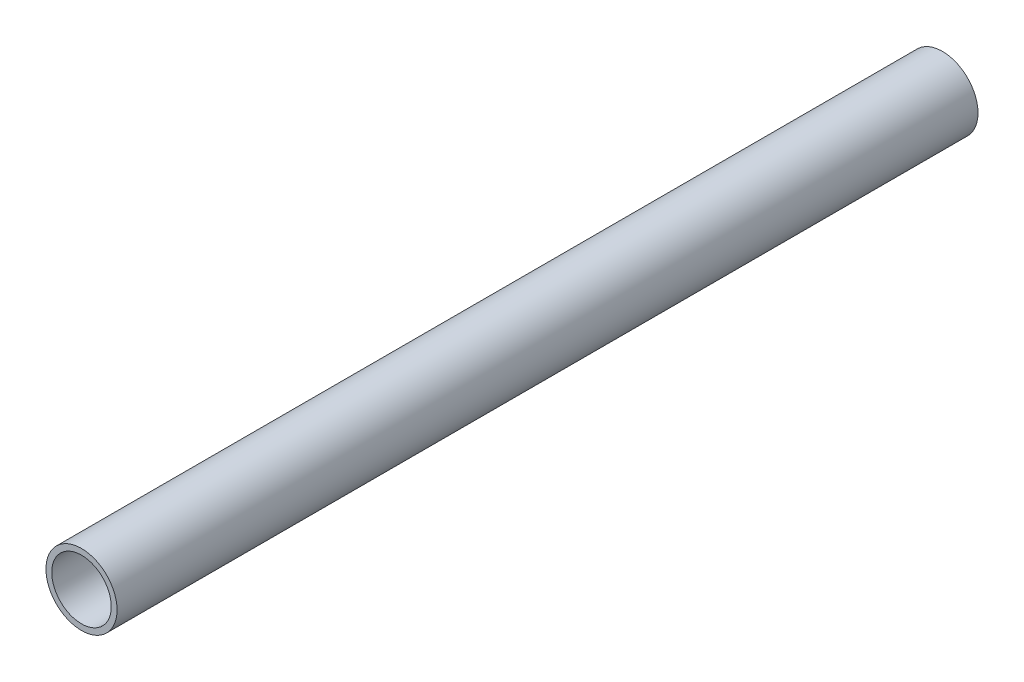
ISO-10303-21;
HEADER;
FILE_DESCRIPTION(('STEP AP214'),'2;1');
FILE_NAME('part.step','',(''),(''),'','','');
FILE_SCHEMA(('AUTOMOTIVE_DESIGN { 1 0 10303 214 1 1 1 1 }'));
ENDSEC;
DATA;
#1=APPLICATION_CONTEXT('core data for automotive mechanical design processes');
#2=APPLICATION_PROTOCOL_DEFINITION('international standard','automotive_design',2000,#1);
#3=PRODUCT_CONTEXT('',#1,'mechanical');
#4=PRODUCT('Part','Part','',(#3));
#5=PRODUCT_RELATED_PRODUCT_CATEGORY('part','',(#4));
#6=PRODUCT_DEFINITION_FORMATION('','',#4);
#7=PRODUCT_DEFINITION_CONTEXT('part definition',#1,'design');
#8=PRODUCT_DEFINITION('design','',#6,#7);
#9=PRODUCT_DEFINITION_SHAPE('','',#8);
#10=(LENGTH_UNIT() NAMED_UNIT(*) SI_UNIT(.MILLI.,.METRE.));
#11=(NAMED_UNIT(*) PLANE_ANGLE_UNIT() SI_UNIT($,.RADIAN.));
#12=(NAMED_UNIT(*) SI_UNIT($,.STERADIAN.) SOLID_ANGLE_UNIT());
#13=UNCERTAINTY_MEASURE_WITH_UNIT(LENGTH_MEASURE(1.E-05),#10,'distance_accuracy_value','');
#14=(GEOMETRIC_REPRESENTATION_CONTEXT(3) GLOBAL_UNCERTAINTY_ASSIGNED_CONTEXT((#13)) GLOBAL_UNIT_ASSIGNED_CONTEXT((#10,
#11,#12)) REPRESENTATION_CONTEXT('',''));
#15=CARTESIAN_POINT('',(0.,0.,0.));
#16=DIRECTION('',(0.,0.,1.));
#17=DIRECTION('',(1.,0.,0.));
#18=AXIS2_PLACEMENT_3D('',#15,#16,#17);
#19=CARTESIAN_POINT('',(0.,0.,584.2));
#20=DIRECTION('',(0.,0.,1.));
#21=DIRECTION('',(1.,0.,0.));
#22=AXIS2_PLACEMENT_3D('',#19,#20,#21);
#23=PLANE('',#22);
#24=CARTESIAN_POINT('',(0.,0.,584.2));
#25=DIRECTION('',(0.,0.,1.));
#26=DIRECTION('',(1.,0.,0.));
#27=AXIS2_PLACEMENT_3D('',#24,#25,#26);
#28=CIRCLE('',#27,24.13);
#29=CARTESIAN_POINT('',(24.13,0.,584.2));
#30=VERTEX_POINT('',#29);
#31=EDGE_CURVE('E10',#30,#30,#28,.T.);
#32=ORIENTED_EDGE('',*,*,#31,.T.);
#33=EDGE_LOOP('',(#32));
#34=FACE_BOUND('',#33,.T.);
#35=CARTESIAN_POINT('',(0.,0.,584.2));
#36=DIRECTION('',(0.,0.,1.));
#37=DIRECTION('',(1.,0.,0.));
#38=AXIS2_PLACEMENT_3D('',#35,#36,#37);
#39=CIRCLE('',#38,20.193);
#40=CARTESIAN_POINT('',(20.193,0.,584.2));
#41=VERTEX_POINT('',#40);
#42=EDGE_CURVE('E42',#41,#41,#39,.T.);
#43=ORIENTED_EDGE('',*,*,#42,.F.);
#44=EDGE_LOOP('',(#43));
#45=FACE_BOUND('',#44,.T.);
#46=ADVANCED_FACE('F31',(#34,#45),#23,.T.);
#47=CARTESIAN_POINT('',(0.,0.,0.));
#48=DIRECTION('',(0.,0.,1.));
#49=DIRECTION('',(1.,0.,0.));
#50=AXIS2_PLACEMENT_3D('',#47,#48,#49);
#51=PLANE('',#50);
#52=CARTESIAN_POINT('',(0.,0.,0.));
#53=DIRECTION('',(0.,0.,1.));
#54=DIRECTION('',(1.,0.,0.));
#55=AXIS2_PLACEMENT_3D('',#52,#53,#54);
#56=CIRCLE('',#55,24.13);
#57=CARTESIAN_POINT('',(24.13,0.,0.));
#58=VERTEX_POINT('',#57);
#59=EDGE_CURVE('E35',#58,#58,#56,.T.);
#60=ORIENTED_EDGE('',*,*,#59,.F.);
#61=EDGE_LOOP('',(#60));
#62=FACE_BOUND('',#61,.T.);
#63=CARTESIAN_POINT('',(0.,0.,0.));
#64=DIRECTION('',(0.,0.,1.));
#65=DIRECTION('',(1.,0.,0.));
#66=AXIS2_PLACEMENT_3D('',#63,#64,#65);
#67=CIRCLE('',#66,20.193);
#68=CARTESIAN_POINT('',(20.193,0.,0.));
#69=VERTEX_POINT('',#68);
#70=EDGE_CURVE('E44',#69,#69,#67,.T.);
#71=ORIENTED_EDGE('',*,*,#70,.T.);
#72=EDGE_LOOP('',(#71));
#73=FACE_BOUND('',#72,.T.);
#74=ADVANCED_FACE('F54',(#62,#73),#51,.F.);
#75=CARTESIAN_POINT('',(0.,0.,584.2));
#76=DIRECTION('',(0.,0.,-1.));
#77=DIRECTION('',(-1.,0.,0.));
#78=AXIS2_PLACEMENT_3D('',#75,#76,#77);
#79=CYLINDRICAL_SURFACE('',#78,24.13);
#80=ORIENTED_EDGE('',*,*,#31,.F.);
#81=EDGE_LOOP('',(#80));
#82=FACE_BOUND('',#81,.T.);
#83=ORIENTED_EDGE('',*,*,#59,.T.);
#84=EDGE_LOOP('',(#83));
#85=FACE_BOUND('',#84,.T.);
#86=ADVANCED_FACE('F33',(#82,#85),#79,.T.);
#87=CARTESIAN_POINT('',(0.,0.,584.2));
#88=DIRECTION('',(0.,0.,-1.));
#89=DIRECTION('',(-1.,0.,0.));
#90=AXIS2_PLACEMENT_3D('',#87,#88,#89);
#91=CYLINDRICAL_SURFACE('',#90,20.193);
#92=ORIENTED_EDGE('',*,*,#42,.T.);
#93=EDGE_LOOP('',(#92));
#94=FACE_BOUND('',#93,.T.);
#95=ORIENTED_EDGE('',*,*,#70,.F.);
#96=EDGE_LOOP('',(#95));
#97=FACE_BOUND('',#96,.T.);
#98=ADVANCED_FACE('F50',(#94,#97),#91,.F.);
#99=CLOSED_SHELL('',(#46,#74,#86,#98));
#100=MANIFOLD_SOLID_BREP('B2',#99);
#101=ADVANCED_BREP_SHAPE_REPRESENTATION('',(#18,#100),#14);
#102=SHAPE_DEFINITION_REPRESENTATION(#9,#101);
ENDSEC;
END-ISO-10303-21;
